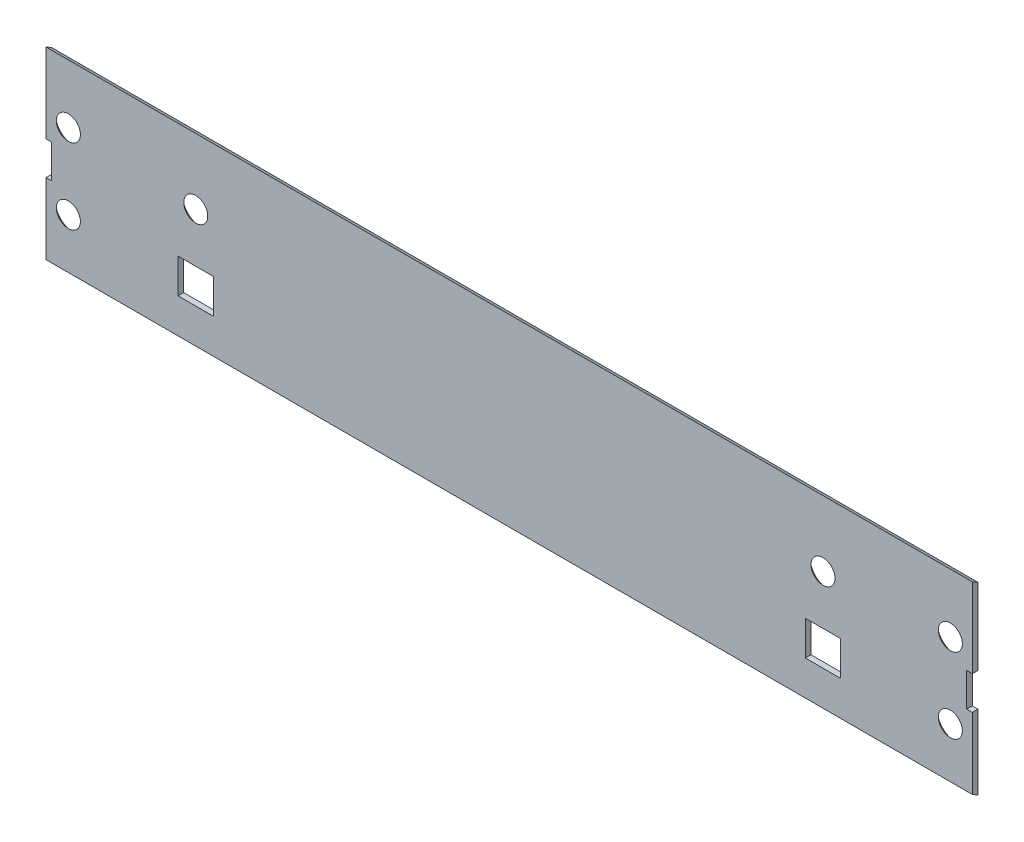
ISO-10303-21;
HEADER;
FILE_DESCRIPTION(('STEP AP214'),'2;1');
FILE_NAME('part.step','',(''),(''),'','','');
FILE_SCHEMA(('AUTOMOTIVE_DESIGN { 1 0 10303 214 1 1 1 1 }'));
ENDSEC;
DATA;
#1=APPLICATION_CONTEXT('core data for automotive mechanical design processes');
#2=APPLICATION_PROTOCOL_DEFINITION('international standard','automotive_design',2000,#1);
#3=PRODUCT_CONTEXT('',#1,'mechanical');
#4=PRODUCT('Part','Part','',(#3));
#5=PRODUCT_RELATED_PRODUCT_CATEGORY('part','',(#4));
#6=PRODUCT_DEFINITION_FORMATION('','',#4);
#7=PRODUCT_DEFINITION_CONTEXT('part definition',#1,'design');
#8=PRODUCT_DEFINITION('design','',#6,#7);
#9=PRODUCT_DEFINITION_SHAPE('','',#8);
#10=(LENGTH_UNIT() NAMED_UNIT(*) SI_UNIT(.MILLI.,.METRE.));
#11=(NAMED_UNIT(*) PLANE_ANGLE_UNIT() SI_UNIT($,.RADIAN.));
#12=(NAMED_UNIT(*) SI_UNIT($,.STERADIAN.) SOLID_ANGLE_UNIT());
#13=UNCERTAINTY_MEASURE_WITH_UNIT(LENGTH_MEASURE(1.E-05),#10,'distance_accuracy_value','');
#14=(GEOMETRIC_REPRESENTATION_CONTEXT(3) GLOBAL_UNCERTAINTY_ASSIGNED_CONTEXT((#13)) GLOBAL_UNIT_ASSIGNED_CONTEXT((#10,
#11,#12)) REPRESENTATION_CONTEXT('',''));
#15=CARTESIAN_POINT('',(0.,0.,0.));
#16=DIRECTION('',(0.,0.,1.));
#17=DIRECTION('',(1.,0.,0.));
#18=AXIS2_PLACEMENT_3D('',#15,#16,#17);
#19=CARTESIAN_POINT('',(0.,0.,1.0668));
#20=DIRECTION('',(0.,0.,1.));
#21=DIRECTION('',(1.,0.,0.));
#22=AXIS2_PLACEMENT_3D('',#19,#20,#21);
#23=PLANE('',#22);
#24=CARTESIAN_POINT('',(59.4550500000001,5.30763211581397,1.0668));
#25=DIRECTION('',(0.,0.,1.));
#26=DIRECTION('',(1.,0.,0.));
#27=AXIS2_PLACEMENT_3D('',#24,#25,#26);
#28=CIRCLE('',#27,2.2719372674205);
#29=CARTESIAN_POINT('',(61.7269872674206,5.30763211581397,1.0668));
#30=VERTEX_POINT('',#29);
#31=EDGE_CURVE('E442',#30,#30,#28,.T.);
#32=ORIENTED_EDGE('',*,*,#31,.F.);
#33=EDGE_LOOP('',(#32));
#34=FACE_BOUND('',#33,.T.);
#35=CARTESIAN_POINT('',(83.5850499999999,-7.64432822383008,1.0668));
#36=DIRECTION('',(0.,0.,1.));
#37=DIRECTION('',(1.,0.,0.));
#38=AXIS2_PLACEMENT_3D('',#35,#36,#37);
#39=CIRCLE('',#38,2.2719372674205);
#40=CARTESIAN_POINT('',(85.8569872674204,-7.64432822383008,1.0668));
#41=VERTEX_POINT('',#40);
#42=EDGE_CURVE('E439',#41,#41,#39,.T.);
#43=ORIENTED_EDGE('',*,*,#42,.F.);
#44=EDGE_LOOP('',(#43));
#45=FACE_BOUND('',#44,.T.);
#46=CARTESIAN_POINT('',(-59.3852,5.30763631581396,1.0668));
#47=DIRECTION('',(0.,0.,1.));
#48=DIRECTION('',(1.,0.,0.));
#49=AXIS2_PLACEMENT_3D('',#46,#47,#48);
#50=CIRCLE('',#49,2.2719372674205);
#51=CARTESIAN_POINT('',(-57.1132627325795,5.30763631581396,1.0668));
#52=VERTEX_POINT('',#51);
#53=EDGE_CURVE('E763',#52,#52,#50,.T.);
#54=ORIENTED_EDGE('',*,*,#53,.F.);
#55=EDGE_LOOP('',(#54));
#56=FACE_BOUND('',#55,.T.);
#57=CARTESIAN_POINT('',(-83.5152,-7.64432402382961,1.0668));
#58=DIRECTION('',(0.,0.,1.));
#59=DIRECTION('',(1.,0.,0.));
#60=AXIS2_PLACEMENT_3D('',#57,#58,#59);
#61=CIRCLE('',#60,2.2719372674205);
#62=CARTESIAN_POINT('',(-81.2432627325795,-7.64432402382961,1.0668));
#63=VERTEX_POINT('',#62);
#64=EDGE_CURVE('E188',#63,#63,#61,.T.);
#65=ORIENTED_EDGE('',*,*,#64,.F.);
#66=EDGE_LOOP('',(#65));
#67=FACE_BOUND('',#66,.T.);
#68=DIRECTION('',(0.,1.,0.));
#69=VECTOR('',#68,1.);
#70=CARTESIAN_POINT('',(56.1022500000001,0.,1.0668));
#71=LINE('',#70,#69);
#72=CARTESIAN_POINT('',(56.1022500000001,-10.567367884186,1.0668));
#73=VERTEX_POINT('',#72);
#74=CARTESIAN_POINT('',(56.1022500000001,-4.03956788418603,1.0668));
#75=VERTEX_POINT('',#74);
#76=EDGE_CURVE('E238',#73,#75,#71,.T.);
#77=ORIENTED_EDGE('',*,*,#76,.T.);
#78=DIRECTION('',(1.,0.,0.));
#79=VECTOR('',#78,1.);
#80=CARTESIAN_POINT('',(0.,-4.03956788418602,1.0668));
#81=LINE('',#80,#79);
#82=CARTESIAN_POINT('',(62.8078500000001,-4.03956788418604,1.0668));
#83=VERTEX_POINT('',#82);
#84=EDGE_CURVE('E243',#75,#83,#81,.T.);
#85=ORIENTED_EDGE('',*,*,#84,.T.);
#86=DIRECTION('',(0.,-1.,0.));
#87=VECTOR('',#86,1.);
#88=CARTESIAN_POINT('',(62.8078500000001,0.,1.0668));
#89=LINE('',#88,#87);
#90=CARTESIAN_POINT('',(62.8078500000001,-10.567367884186,1.0668));
#91=VERTEX_POINT('',#90);
#92=EDGE_CURVE('E252',#83,#91,#89,.T.);
#93=ORIENTED_EDGE('',*,*,#92,.T.);
#94=DIRECTION('',(-1.,0.,0.));
#95=VECTOR('',#94,1.);
#96=CARTESIAN_POINT('',(0.,-10.567367884186,1.0668));
#97=LINE('',#96,#95);
#98=EDGE_CURVE('E257',#91,#73,#97,.T.);
#99=ORIENTED_EDGE('',*,*,#98,.T.);
#100=EDGE_LOOP('',(#77,#85,#93,#99));
#101=FACE_BOUND('',#100,.T.);
#102=DIRECTION('',(0.,1.,0.));
#103=VECTOR('',#102,1.);
#104=CARTESIAN_POINT('',(-62.738,0.,1.0668));
#105=LINE('',#104,#103);
#106=CARTESIAN_POINT('',(-62.738,-10.567363684186,1.0668));
#107=VERTEX_POINT('',#106);
#108=CARTESIAN_POINT('',(-62.738,-4.03956368418605,1.0668));
#109=VERTEX_POINT('',#108);
#110=EDGE_CURVE('E245',#107,#109,#105,.T.);
#111=ORIENTED_EDGE('',*,*,#110,.T.);
#112=DIRECTION('',(1.,0.,0.));
#113=VECTOR('',#112,1.);
#114=CARTESIAN_POINT('',(0.,-4.03956368418606,1.0668));
#115=LINE('',#114,#113);
#116=CARTESIAN_POINT('',(-56.0324,-4.03956368418605,1.0668));
#117=VERTEX_POINT('',#116);
#118=EDGE_CURVE('E266',#109,#117,#115,.T.);
#119=ORIENTED_EDGE('',*,*,#118,.T.);
#120=DIRECTION('',(0.,-1.,0.));
#121=VECTOR('',#120,1.);
#122=CARTESIAN_POINT('',(-56.0324,0.,1.0668));
#123=LINE('',#122,#121);
#124=CARTESIAN_POINT('',(-56.0324,-10.567363684186,1.0668));
#125=VERTEX_POINT('',#124);
#126=EDGE_CURVE('E270',#117,#125,#123,.T.);
#127=ORIENTED_EDGE('',*,*,#126,.T.);
#128=DIRECTION('',(-1.,0.,0.));
#129=VECTOR('',#128,1.);
#130=CARTESIAN_POINT('',(0.,-10.5673636841861,1.0668));
#131=LINE('',#130,#129);
#132=EDGE_CURVE('E275',#125,#107,#131,.T.);
#133=ORIENTED_EDGE('',*,*,#132,.T.);
#134=EDGE_LOOP('',(#111,#119,#127,#133));
#135=FACE_BOUND('',#134,.T.);
#136=DIRECTION('',(-1.,0.,0.));
#137=VECTOR('',#136,1.);
#138=CARTESIAN_POINT('',(-86.7600499999999,-3.66971216592286,1.0668));
#139=LINE('',#138,#137);
#140=CARTESIAN_POINT('',(-86.7600499999999,-3.66971216592286,1.0668));
#141=VERTEX_POINT('',#140);
#142=CARTESIAN_POINT('',(-87.757,-3.66971216592286,1.0668));
#143=VERTEX_POINT('',#142);
#144=EDGE_CURVE('E183',#141,#143,#139,.T.);
#145=ORIENTED_EDGE('',*,*,#144,.T.);
#146=DIRECTION('',(0.,-1.,0.));
#147=VECTOR('',#146,1.);
#148=CARTESIAN_POINT('',(-87.757,17.7546,1.0668));
#149=LINE('',#148,#147);
#150=CARTESIAN_POINT('',(-87.757,-17.1386827328285,1.0668));
#151=VERTEX_POINT('',#150);
#152=EDGE_CURVE('E395',#143,#151,#149,.T.);
#153=ORIENTED_EDGE('',*,*,#152,.T.);
#154=DIRECTION('',(-1.,0.,0.));
#155=VECTOR('',#154,1.);
#156=CARTESIAN_POINT('',(87.757,-17.1386827328285,1.0668));
#157=LINE('',#156,#155);
#158=CARTESIAN_POINT('',(87.757,-17.1386827328285,1.0668));
#159=VERTEX_POINT('',#158);
#160=EDGE_CURVE('E372',#159,#151,#157,.T.);
#161=ORIENTED_EDGE('',*,*,#160,.F.);
#162=DIRECTION('',(0.,1.,0.));
#163=VECTOR('',#162,1.);
#164=CARTESIAN_POINT('',(87.757,17.7546,1.0668));
#165=LINE('',#164,#163);
#166=CARTESIAN_POINT('',(87.757,-3.66971636592319,1.0668));
#167=VERTEX_POINT('',#166);
#168=EDGE_CURVE('E382',#159,#167,#165,.T.);
#169=ORIENTED_EDGE('',*,*,#168,.T.);
#170=DIRECTION('',(-1.,0.,0.));
#171=VECTOR('',#170,1.);
#172=CARTESIAN_POINT('',(87.757,-3.66971636592319,1.0668));
#173=LINE('',#172,#171);
#174=CARTESIAN_POINT('',(86.6902,-3.66971636592319,1.0668));
#175=VERTEX_POINT('',#174);
#176=EDGE_CURVE('E313',#167,#175,#173,.T.);
#177=ORIENTED_EDGE('',*,*,#176,.T.);
#178=DIRECTION('',(0.,1.,0.));
#179=VECTOR('',#178,1.);
#180=CARTESIAN_POINT('',(86.6902,-3.66971636592319,1.0668));
#181=LINE('',#180,#179);
#182=CARTESIAN_POINT('',(86.6902,2.68028363407683,1.0668));
#183=VERTEX_POINT('',#182);
#184=EDGE_CURVE('E295',#175,#183,#181,.T.);
#185=ORIENTED_EDGE('',*,*,#184,.T.);
#186=DIRECTION('',(1.,-2.5367159941168E-13,0.));
#187=VECTOR('',#186,1.);
#188=CARTESIAN_POINT('',(86.6902,2.68028363407683,1.0668));
#189=LINE('',#188,#187);
#190=CARTESIAN_POINT('',(87.757,2.68028363407656,1.0668));
#191=VERTEX_POINT('',#190);
#192=EDGE_CURVE('E304',#183,#191,#189,.T.);
#193=ORIENTED_EDGE('',*,*,#192,.T.);
#194=CARTESIAN_POINT('',(87.757,17.7546,1.0668));
#195=VERTEX_POINT('',#194);
#196=EDGE_CURVE('E389',#191,#195,#165,.T.);
#197=ORIENTED_EDGE('',*,*,#196,.T.);
#198=DIRECTION('',(-1.,0.,0.));
#199=VECTOR('',#198,1.);
#200=CARTESIAN_POINT('',(-87.757,17.7546,1.0668));
#201=LINE('',#200,#199);
#202=CARTESIAN_POINT('',(-87.757,17.7546,1.0668));
#203=VERTEX_POINT('',#202);
#204=EDGE_CURVE('E388',#195,#203,#201,.T.);
#205=ORIENTED_EDGE('',*,*,#204,.T.);
#206=CARTESIAN_POINT('',(-87.757,2.68028783407717,1.0668));
#207=VERTEX_POINT('',#206);
#208=EDGE_CURVE('E48',#203,#207,#149,.T.);
#209=ORIENTED_EDGE('',*,*,#208,.T.);
#210=DIRECTION('',(1.,0.,0.));
#211=VECTOR('',#210,1.);
#212=CARTESIAN_POINT('',(-87.8268499999999,2.68028783407717,1.0668));
#213=LINE('',#212,#211);
#214=CARTESIAN_POINT('',(-86.7600499999999,2.68028783407717,1.0668));
#215=VERTEX_POINT('',#214);
#216=EDGE_CURVE('E208',#207,#215,#213,.T.);
#217=ORIENTED_EDGE('',*,*,#216,.T.);
#218=DIRECTION('',(0.,-1.,0.));
#219=VECTOR('',#218,1.);
#220=CARTESIAN_POINT('',(-86.7600499999999,2.68028783407717,1.0668));
#221=LINE('',#220,#219);
#222=EDGE_CURVE('E204',#215,#141,#221,.T.);
#223=ORIENTED_EDGE('',*,*,#222,.T.);
#224=EDGE_LOOP('',(#145,#153,#161,#169,#177,#185,#193,#197,#205,#209,#217,#223));
#225=FACE_BOUND('',#224,.T.);
#226=CARTESIAN_POINT('',(-83.5152,6.64317597617039,1.0668));
#227=DIRECTION('',(0.,0.,1.));
#228=DIRECTION('',(1.,0.,0.));
#229=AXIS2_PLACEMENT_3D('',#226,#227,#228);
#230=CIRCLE('',#229,2.2719372674205);
#231=CARTESIAN_POINT('',(-81.2432627325795,6.64317597617039,1.0668));
#232=VERTEX_POINT('',#231);
#233=EDGE_CURVE('E215',#232,#232,#230,.T.);
#234=ORIENTED_EDGE('',*,*,#233,.F.);
#235=EDGE_LOOP('',(#234));
#236=FACE_BOUND('',#235,.T.);
#237=CARTESIAN_POINT('',(83.5850499999999,6.64317177616992,1.0668));
#238=DIRECTION('',(0.,0.,1.));
#239=DIRECTION('',(1.,0.,0.));
#240=AXIS2_PLACEMENT_3D('',#237,#238,#239);
#241=CIRCLE('',#240,2.2719372674205);
#242=CARTESIAN_POINT('',(85.8569872674204,6.64317177616992,1.0668));
#243=VERTEX_POINT('',#242);
#244=EDGE_CURVE('E432',#243,#243,#241,.T.);
#245=ORIENTED_EDGE('',*,*,#244,.F.);
#246=EDGE_LOOP('',(#245));
#247=FACE_BOUND('',#246,.T.);
#248=ADVANCED_FACE('F40',(#34,#45,#56,#67,#101,#135,#225,#236,#247),#23,.T.);
#249=CARTESIAN_POINT('',(-87.757,17.7546,1.0668));
#250=DIRECTION('',(1.,0.,0.));
#251=DIRECTION('',(0.,0.,-1.));
#252=AXIS2_PLACEMENT_3D('',#249,#250,#251);
#253=PLANE('',#252);
#254=ORIENTED_EDGE('',*,*,#152,.F.);
#255=DIRECTION('',(0.,0.,-1.));
#256=VECTOR('',#255,1.);
#257=CARTESIAN_POINT('',(-87.757,-3.66971216592286,1.0668));
#258=LINE('',#257,#256);
#259=CARTESIAN_POINT('',(-87.757,-3.66971216592286,0.));
#260=VERTEX_POINT('',#259);
#261=EDGE_CURVE('E201',#143,#260,#258,.T.);
#262=ORIENTED_EDGE('',*,*,#261,.T.);
#263=DIRECTION('',(0.,-1.,0.));
#264=VECTOR('',#263,1.);
#265=CARTESIAN_POINT('',(-87.757,17.7546,0.));
#266=LINE('',#265,#264);
#267=CARTESIAN_POINT('',(-87.757,-17.7546,0.));
#268=VERTEX_POINT('',#267);
#269=EDGE_CURVE('E199',#260,#268,#266,.T.);
#270=ORIENTED_EDGE('',*,*,#269,.T.);
#271=DIRECTION('',(0.,-0.500000000000003,-0.866025403784437));
#272=VECTOR('',#271,1.);
#273=CARTESIAN_POINT('',(-87.757,-17.7546,0.));
#274=LINE('',#273,#272);
#275=EDGE_CURVE('E362',#151,#268,#274,.T.);
#276=ORIENTED_EDGE('',*,*,#275,.F.);
#277=EDGE_LOOP('',(#254,#262,#270,#276));
#278=FACE_BOUND('',#277,.T.);
#279=ADVANCED_FACE('F524',(#278),#253,.F.);
#280=CARTESIAN_POINT('',(87.757,17.7546,1.0668));
#281=DIRECTION('',(-1.,0.,0.));
#282=DIRECTION('',(0.,0.,1.));
#283=AXIS2_PLACEMENT_3D('',#280,#281,#282);
#284=PLANE('',#283);
#285=ORIENTED_EDGE('',*,*,#196,.F.);
#286=DIRECTION('',(0.,0.,-1.));
#287=VECTOR('',#286,1.);
#288=CARTESIAN_POINT('',(87.757,2.68028363407656,1.0668));
#289=LINE('',#288,#287);
#290=CARTESIAN_POINT('',(87.757,2.68028363407656,0.));
#291=VERTEX_POINT('',#290);
#292=EDGE_CURVE('E292',#191,#291,#289,.T.);
#293=ORIENTED_EDGE('',*,*,#292,.T.);
#294=DIRECTION('',(0.,1.,0.));
#295=VECTOR('',#294,1.);
#296=CARTESIAN_POINT('',(87.757,17.7546,0.));
#297=LINE('',#296,#295);
#298=CARTESIAN_POINT('',(87.757,17.1386827328285,0.));
#299=VERTEX_POINT('',#298);
#300=EDGE_CURVE('E404',#291,#299,#297,.T.);
#301=ORIENTED_EDGE('',*,*,#300,.T.);
#302=DIRECTION('',(0.,0.500000000000011,0.866025403784432));
#303=VECTOR('',#302,1.);
#304=CARTESIAN_POINT('',(87.757,17.1386827328285,0.));
#305=LINE('',#304,#303);
#306=EDGE_CURVE('E380',#299,#195,#305,.T.);
#307=ORIENTED_EDGE('',*,*,#306,.T.);
#308=EDGE_LOOP('',(#285,#293,#301,#307));
#309=FACE_BOUND('',#308,.T.);
#310=ADVANCED_FACE('F423',(#309),#284,.F.);
#311=CARTESIAN_POINT('',(87.757,-17.7546,0.));
#312=VERTEX_POINT('',#311);
#313=CARTESIAN_POINT('',(87.757,-3.66971636592318,0.));
#314=VERTEX_POINT('',#313);
#315=EDGE_CURVE('E400',#312,#314,#297,.T.);
#316=ORIENTED_EDGE('',*,*,#315,.T.);
#317=DIRECTION('',(0.,0.,-1.));
#318=VECTOR('',#317,1.);
#319=CARTESIAN_POINT('',(87.757,-3.66971636592319,1.0668));
#320=LINE('',#319,#318);
#321=EDGE_CURVE('E62',#167,#314,#320,.T.);
#322=ORIENTED_EDGE('',*,*,#321,.F.);
#323=ORIENTED_EDGE('',*,*,#168,.F.);
#324=DIRECTION('',(0.,-0.500000000000003,-0.866025403784437));
#325=VECTOR('',#324,1.);
#326=CARTESIAN_POINT('',(87.757,-17.7546,0.));
#327=LINE('',#326,#325);
#328=EDGE_CURVE('E369',#159,#312,#327,.T.);
#329=ORIENTED_EDGE('',*,*,#328,.T.);
#330=EDGE_LOOP('',(#316,#322,#323,#329));
#331=FACE_BOUND('',#330,.T.);
#332=ADVANCED_FACE('F42',(#331),#284,.F.);
#333=CARTESIAN_POINT('',(-87.757,17.1386827328285,0.));
#334=VERTEX_POINT('',#333);
#335=CARTESIAN_POINT('',(-87.757,2.68028783407717,0.));
#336=VERTEX_POINT('',#335);
#337=EDGE_CURVE('E405',#334,#336,#266,.T.);
#338=ORIENTED_EDGE('',*,*,#337,.T.);
#339=DIRECTION('',(0.,0.,1.));
#340=VECTOR('',#339,1.);
#341=CARTESIAN_POINT('',(-87.757,2.68028783407717,1.0668));
#342=LINE('',#341,#340);
#343=EDGE_CURVE('E55',#336,#207,#342,.T.);
#344=ORIENTED_EDGE('',*,*,#343,.T.);
#345=ORIENTED_EDGE('',*,*,#208,.F.);
#346=DIRECTION('',(0.,0.500000000000011,0.866025403784432));
#347=VECTOR('',#346,1.);
#348=CARTESIAN_POINT('',(-87.757,17.1386827328285,0.));
#349=LINE('',#348,#347);
#350=EDGE_CURVE('E379',#334,#203,#349,.T.);
#351=ORIENTED_EDGE('',*,*,#350,.F.);
#352=EDGE_LOOP('',(#338,#344,#345,#351));
#353=FACE_BOUND('',#352,.T.);
#354=ADVANCED_FACE('F427',(#353),#253,.F.);
#355=CARTESIAN_POINT('',(0.,0.,0.));
#356=DIRECTION('',(0.,0.,1.));
#357=DIRECTION('',(1.,0.,0.));
#358=AXIS2_PLACEMENT_3D('',#355,#356,#357);
#359=PLANE('',#358);
#360=CARTESIAN_POINT('',(59.4550500000001,5.30763211581397,0.));
#361=DIRECTION('',(0.,0.,-1.));
#362=DIRECTION('',(-1.,0.,0.));
#363=AXIS2_PLACEMENT_3D('',#360,#361,#362);
#364=CIRCLE('',#363,3.5433);
#365=CARTESIAN_POINT('',(55.9117500000001,5.30763211581397,0.));
#366=VERTEX_POINT('',#365);
#367=EDGE_CURVE('E457',#366,#366,#364,.T.);
#368=ORIENTED_EDGE('',*,*,#367,.F.);
#369=EDGE_LOOP('',(#368));
#370=FACE_BOUND('',#369,.T.);
#371=CARTESIAN_POINT('',(83.5850499999999,6.64317177616992,0.));
#372=DIRECTION('',(0.,0.,-1.));
#373=DIRECTION('',(-1.,0.,0.));
#374=AXIS2_PLACEMENT_3D('',#371,#372,#373);
#375=CIRCLE('',#374,3.5433);
#376=CARTESIAN_POINT('',(80.0417499999999,6.64317177616992,0.));
#377=VERTEX_POINT('',#376);
#378=EDGE_CURVE('E435',#377,#377,#375,.T.);
#379=ORIENTED_EDGE('',*,*,#378,.F.);
#380=EDGE_LOOP('',(#379));
#381=FACE_BOUND('',#380,.T.);
#382=CARTESIAN_POINT('',(83.5850499999999,-7.64432822383008,0.));
#383=DIRECTION('',(0.,0.,-1.));
#384=DIRECTION('',(-1.,0.,0.));
#385=AXIS2_PLACEMENT_3D('',#382,#383,#384);
#386=CIRCLE('',#385,3.5433);
#387=CARTESIAN_POINT('',(80.0417499999999,-7.64432822383008,0.));
#388=VERTEX_POINT('',#387);
#389=EDGE_CURVE('E434',#388,#388,#386,.T.);
#390=ORIENTED_EDGE('',*,*,#389,.F.);
#391=EDGE_LOOP('',(#390));
#392=FACE_BOUND('',#391,.T.);
#393=CARTESIAN_POINT('',(-59.3852,5.30763631581396,0.));
#394=DIRECTION('',(0.,0.,-1.));
#395=DIRECTION('',(-1.,0.,0.));
#396=AXIS2_PLACEMENT_3D('',#393,#394,#395);
#397=CIRCLE('',#396,3.5433);
#398=CARTESIAN_POINT('',(-62.9285,5.30763631581396,0.));
#399=VERTEX_POINT('',#398);
#400=EDGE_CURVE('E451',#399,#399,#397,.T.);
#401=ORIENTED_EDGE('',*,*,#400,.F.);
#402=EDGE_LOOP('',(#401));
#403=FACE_BOUND('',#402,.T.);
#404=CARTESIAN_POINT('',(-83.5152,6.64317597617039,0.));
#405=DIRECTION('',(0.,0.,-1.));
#406=DIRECTION('',(-1.,0.,0.));
#407=AXIS2_PLACEMENT_3D('',#404,#405,#406);
#408=CIRCLE('',#407,3.5433);
#409=CARTESIAN_POINT('',(-87.0585,6.64317597617039,0.));
#410=VERTEX_POINT('',#409);
#411=EDGE_CURVE('E222',#410,#410,#408,.T.);
#412=ORIENTED_EDGE('',*,*,#411,.F.);
#413=EDGE_LOOP('',(#412));
#414=FACE_BOUND('',#413,.T.);
#415=CARTESIAN_POINT('',(-83.5152,-7.64432402382961,0.));
#416=DIRECTION('',(0.,0.,-1.));
#417=DIRECTION('',(-1.,0.,0.));
#418=AXIS2_PLACEMENT_3D('',#415,#416,#417);
#419=CIRCLE('',#418,3.5433);
#420=CARTESIAN_POINT('',(-87.0585,-7.64432402382961,0.));
#421=VERTEX_POINT('',#420);
#422=EDGE_CURVE('E221',#421,#421,#419,.T.);
#423=ORIENTED_EDGE('',*,*,#422,.F.);
#424=EDGE_LOOP('',(#423));
#425=FACE_BOUND('',#424,.T.);
#426=DIRECTION('',(1.,0.,0.));
#427=VECTOR('',#426,1.);
#428=CARTESIAN_POINT('',(0.,-4.03956368418606,0.));
#429=LINE('',#428,#427);
#430=CARTESIAN_POINT('',(-62.738,-4.03956368418605,0.));
#431=VERTEX_POINT('',#430);
#432=CARTESIAN_POINT('',(-56.0324,-4.03956368418605,0.));
#433=VERTEX_POINT('',#432);
#434=EDGE_CURVE('E339',#431,#433,#429,.T.);
#435=ORIENTED_EDGE('',*,*,#434,.F.);
#436=DIRECTION('',(0.,1.,0.));
#437=VECTOR('',#436,1.);
#438=CARTESIAN_POINT('',(-62.738,0.,0.));
#439=LINE('',#438,#437);
#440=CARTESIAN_POINT('',(-62.738,-10.567363684186,0.));
#441=VERTEX_POINT('',#440);
#442=EDGE_CURVE('E281',#441,#431,#439,.T.);
#443=ORIENTED_EDGE('',*,*,#442,.F.);
#444=DIRECTION('',(-1.,0.,0.));
#445=VECTOR('',#444,1.);
#446=CARTESIAN_POINT('',(0.,-10.5673636841861,0.));
#447=LINE('',#446,#445);
#448=CARTESIAN_POINT('',(-56.0324,-10.567363684186,0.));
#449=VERTEX_POINT('',#448);
#450=EDGE_CURVE('E334',#449,#441,#447,.T.);
#451=ORIENTED_EDGE('',*,*,#450,.F.);
#452=DIRECTION('',(0.,-1.,0.));
#453=VECTOR('',#452,1.);
#454=CARTESIAN_POINT('',(-56.0324,0.,0.));
#455=LINE('',#454,#453);
#456=EDGE_CURVE('E337',#433,#449,#455,.T.);
#457=ORIENTED_EDGE('',*,*,#456,.F.);
#458=EDGE_LOOP('',(#435,#443,#451,#457));
#459=FACE_BOUND('',#458,.T.);
#460=DIRECTION('',(1.,0.,0.));
#461=VECTOR('',#460,1.);
#462=CARTESIAN_POINT('',(0.,-4.03956788418602,0.));
#463=LINE('',#462,#461);
#464=CARTESIAN_POINT('',(56.1022500000001,-4.03956788418603,0.));
#465=VERTEX_POINT('',#464);
#466=CARTESIAN_POINT('',(62.8078500000001,-4.03956788418604,0.));
#467=VERTEX_POINT('',#466);
#468=EDGE_CURVE('E348',#465,#467,#463,.T.);
#469=ORIENTED_EDGE('',*,*,#468,.F.);
#470=DIRECTION('',(0.,1.,0.));
#471=VECTOR('',#470,1.);
#472=CARTESIAN_POINT('',(56.1022500000001,0.,0.));
#473=LINE('',#472,#471);
#474=CARTESIAN_POINT('',(56.1022500000001,-10.567367884186,0.));
#475=VERTEX_POINT('',#474);
#476=EDGE_CURVE('E345',#475,#465,#473,.T.);
#477=ORIENTED_EDGE('',*,*,#476,.F.);
#478=DIRECTION('',(-1.,0.,0.));
#479=VECTOR('',#478,1.);
#480=CARTESIAN_POINT('',(0.,-10.567367884186,0.));
#481=LINE('',#480,#479);
#482=CARTESIAN_POINT('',(62.8078500000001,-10.567367884186,0.));
#483=VERTEX_POINT('',#482);
#484=EDGE_CURVE('E244',#483,#475,#481,.T.);
#485=ORIENTED_EDGE('',*,*,#484,.F.);
#486=DIRECTION('',(0.,-1.,0.));
#487=VECTOR('',#486,1.);
#488=CARTESIAN_POINT('',(62.8078500000001,0.,0.));
#489=LINE('',#488,#487);
#490=EDGE_CURVE('E353',#467,#483,#489,.T.);
#491=ORIENTED_EDGE('',*,*,#490,.F.);
#492=EDGE_LOOP('',(#469,#477,#485,#491));
#493=FACE_BOUND('',#492,.T.);
#494=ORIENTED_EDGE('',*,*,#269,.F.);
#495=DIRECTION('',(-1.,0.,0.));
#496=VECTOR('',#495,1.);
#497=CARTESIAN_POINT('',(-86.7600499999999,-3.66971216592286,0.));
#498=LINE('',#497,#496);
#499=CARTESIAN_POINT('',(-86.7600499999999,-3.66971216592286,0.));
#500=VERTEX_POINT('',#499);
#501=EDGE_CURVE('E180',#500,#260,#498,.T.);
#502=ORIENTED_EDGE('',*,*,#501,.F.);
#503=DIRECTION('',(0.,-1.,0.));
#504=VECTOR('',#503,1.);
#505=CARTESIAN_POINT('',(-86.7600499999999,2.68028783407717,0.));
#506=LINE('',#505,#504);
#507=CARTESIAN_POINT('',(-86.7600499999999,2.68028783407717,0.));
#508=VERTEX_POINT('',#507);
#509=EDGE_CURVE('E192',#508,#500,#506,.T.);
#510=ORIENTED_EDGE('',*,*,#509,.F.);
#511=DIRECTION('',(-1.,0.,0.));
#512=VECTOR('',#511,1.);
#513=CARTESIAN_POINT('',(0.,2.68028783407717,0.));
#514=LINE('',#513,#512);
#515=EDGE_CURVE('E12',#508,#336,#514,.T.);
#516=ORIENTED_EDGE('',*,*,#515,.T.);
#517=ORIENTED_EDGE('',*,*,#337,.F.);
#518=DIRECTION('',(-1.,0.,0.));
#519=VECTOR('',#518,1.);
#520=CARTESIAN_POINT('',(87.757,17.1386827328285,0.));
#521=LINE('',#520,#519);
#522=EDGE_CURVE('E390',#299,#334,#521,.T.);
#523=ORIENTED_EDGE('',*,*,#522,.F.);
#524=ORIENTED_EDGE('',*,*,#300,.F.);
#525=DIRECTION('',(1.,-2.5367159941168E-13,0.));
#526=VECTOR('',#525,1.);
#527=CARTESIAN_POINT('',(86.6902,2.68028363407683,0.));
#528=LINE('',#527,#526);
#529=CARTESIAN_POINT('',(86.6902,2.68028363407683,0.));
#530=VERTEX_POINT('',#529);
#531=EDGE_CURVE('E306',#530,#291,#528,.T.);
#532=ORIENTED_EDGE('',*,*,#531,.F.);
#533=DIRECTION('',(0.,1.,0.));
#534=VECTOR('',#533,1.);
#535=CARTESIAN_POINT('',(86.6902,-3.66971636592319,0.));
#536=LINE('',#535,#534);
#537=CARTESIAN_POINT('',(86.6902,-3.66971636592319,0.));
#538=VERTEX_POINT('',#537);
#539=EDGE_CURVE('E300',#538,#530,#536,.T.);
#540=ORIENTED_EDGE('',*,*,#539,.F.);
#541=DIRECTION('',(-1.,0.,0.));
#542=VECTOR('',#541,1.);
#543=CARTESIAN_POINT('',(87.757,-3.66971636592319,0.));
#544=LINE('',#543,#542);
#545=EDGE_CURVE('E303',#314,#538,#544,.T.);
#546=ORIENTED_EDGE('',*,*,#545,.F.);
#547=ORIENTED_EDGE('',*,*,#315,.F.);
#548=DIRECTION('',(1.,0.,0.));
#549=VECTOR('',#548,1.);
#550=CARTESIAN_POINT('',(-87.757,-17.7546,0.));
#551=LINE('',#550,#549);
#552=EDGE_CURVE('E407',#268,#312,#551,.T.);
#553=ORIENTED_EDGE('',*,*,#552,.F.);
#554=EDGE_LOOP('',(#494,#502,#510,#516,#517,#523,#524,#532,#540,#546,#547,#553));
#555=FACE_BOUND('',#554,.T.);
#556=ADVANCED_FACE('F197',(#370,#381,#392,#403,#414,#425,#459,#493,#555),#359,.F.);
#557=CARTESIAN_POINT('',(87.757,17.1386827328285,0.));
#558=DIRECTION('',(0.,-0.866025403784432,0.500000000000011));
#559=DIRECTION('',(0.,-0.500000000000011,-0.866025403784432));
#560=AXIS2_PLACEMENT_3D('',#557,#558,#559);
#561=PLANE('',#560);
#562=ORIENTED_EDGE('',*,*,#350,.T.);
#563=ORIENTED_EDGE('',*,*,#204,.F.);
#564=ORIENTED_EDGE('',*,*,#306,.F.);
#565=ORIENTED_EDGE('',*,*,#522,.T.);
#566=EDGE_LOOP('',(#562,#563,#564,#565));
#567=FACE_BOUND('',#566,.T.);
#568=ADVANCED_FACE('F420',(#567),#561,.F.);
#569=CARTESIAN_POINT('',(87.757,-17.7546,0.));
#570=DIRECTION('',(0.,0.866025403784437,-0.500000000000003));
#571=DIRECTION('',(0.,0.500000000000003,0.866025403784437));
#572=AXIS2_PLACEMENT_3D('',#569,#570,#571);
#573=PLANE('',#572);
#574=ORIENTED_EDGE('',*,*,#275,.T.);
#575=ORIENTED_EDGE('',*,*,#552,.T.);
#576=ORIENTED_EDGE('',*,*,#328,.F.);
#577=ORIENTED_EDGE('',*,*,#160,.T.);
#578=EDGE_LOOP('',(#574,#575,#576,#577));
#579=FACE_BOUND('',#578,.T.);
#580=ADVANCED_FACE('F554',(#579),#573,.F.);
#581=CARTESIAN_POINT('',(56.1022500000001,0.,1.0668));
#582=DIRECTION('',(-1.,0.,0.));
#583=DIRECTION('',(0.,0.,1.));
#584=AXIS2_PLACEMENT_3D('',#581,#582,#583);
#585=PLANE('',#584);
#586=ORIENTED_EDGE('',*,*,#476,.T.);
#587=DIRECTION('',(0.,0.,-1.));
#588=VECTOR('',#587,1.);
#589=CARTESIAN_POINT('',(56.1022500000001,-4.03956788418603,1.0668));
#590=LINE('',#589,#588);
#591=EDGE_CURVE('E367',#75,#465,#590,.T.);
#592=ORIENTED_EDGE('',*,*,#591,.F.);
#593=ORIENTED_EDGE('',*,*,#76,.F.);
#594=DIRECTION('',(0.,0.,-1.));
#595=VECTOR('',#594,1.);
#596=CARTESIAN_POINT('',(56.1022500000001,-10.567367884186,1.0668));
#597=LINE('',#596,#595);
#598=EDGE_CURVE('E360',#73,#475,#597,.T.);
#599=ORIENTED_EDGE('',*,*,#598,.T.);
#600=EDGE_LOOP('',(#586,#592,#593,#599));
#601=FACE_BOUND('',#600,.T.);
#602=ADVANCED_FACE('F487',(#601),#585,.F.);
#603=CARTESIAN_POINT('',(0.,-10.567367884186,1.0668));
#604=DIRECTION('',(0.,-1.,0.));
#605=DIRECTION('',(1.,0.,0.));
#606=AXIS2_PLACEMENT_3D('',#603,#604,#605);
#607=PLANE('',#606);
#608=ORIENTED_EDGE('',*,*,#484,.T.);
#609=ORIENTED_EDGE('',*,*,#598,.F.);
#610=ORIENTED_EDGE('',*,*,#98,.F.);
#611=DIRECTION('',(0.,0.,-1.));
#612=VECTOR('',#611,1.);
#613=CARTESIAN_POINT('',(62.8078500000001,-10.567367884186,1.0668));
#614=LINE('',#613,#612);
#615=EDGE_CURVE('E363',#91,#483,#614,.T.);
#616=ORIENTED_EDGE('',*,*,#615,.T.);
#617=EDGE_LOOP('',(#608,#609,#610,#616));
#618=FACE_BOUND('',#617,.T.);
#619=ADVANCED_FACE('F716',(#618),#607,.F.);
#620=CARTESIAN_POINT('',(62.8078500000001,0.,1.0668));
#621=DIRECTION('',(1.,0.,0.));
#622=DIRECTION('',(0.,0.,-1.));
#623=AXIS2_PLACEMENT_3D('',#620,#621,#622);
#624=PLANE('',#623);
#625=ORIENTED_EDGE('',*,*,#490,.T.);
#626=ORIENTED_EDGE('',*,*,#615,.F.);
#627=ORIENTED_EDGE('',*,*,#92,.F.);
#628=DIRECTION('',(0.,0.,-1.));
#629=VECTOR('',#628,1.);
#630=CARTESIAN_POINT('',(62.8078500000001,-4.03956788418604,1.0668));
#631=LINE('',#630,#629);
#632=EDGE_CURVE('E365',#83,#467,#631,.T.);
#633=ORIENTED_EDGE('',*,*,#632,.T.);
#634=EDGE_LOOP('',(#625,#626,#627,#633));
#635=FACE_BOUND('',#634,.T.);
#636=ADVANCED_FACE('F707',(#635),#624,.F.);
#637=CARTESIAN_POINT('',(0.,-4.03956788418602,1.0668));
#638=DIRECTION('',(0.,1.,0.));
#639=DIRECTION('',(-1.,0.,0.));
#640=AXIS2_PLACEMENT_3D('',#637,#638,#639);
#641=PLANE('',#640);
#642=ORIENTED_EDGE('',*,*,#468,.T.);
#643=ORIENTED_EDGE('',*,*,#632,.F.);
#644=ORIENTED_EDGE('',*,*,#84,.F.);
#645=ORIENTED_EDGE('',*,*,#591,.T.);
#646=EDGE_LOOP('',(#642,#643,#644,#645));
#647=FACE_BOUND('',#646,.T.);
#648=ADVANCED_FACE('F484',(#647),#641,.F.);
#649=CARTESIAN_POINT('',(-62.738,0.,1.0668));
#650=DIRECTION('',(-1.,0.,0.));
#651=DIRECTION('',(0.,0.,1.));
#652=AXIS2_PLACEMENT_3D('',#649,#650,#651);
#653=PLANE('',#652);
#654=ORIENTED_EDGE('',*,*,#442,.T.);
#655=DIRECTION('',(0.,0.,-1.));
#656=VECTOR('',#655,1.);
#657=CARTESIAN_POINT('',(-62.738,-4.03956368418605,1.0668));
#658=LINE('',#657,#656);
#659=EDGE_CURVE('E280',#109,#431,#658,.T.);
#660=ORIENTED_EDGE('',*,*,#659,.F.);
#661=ORIENTED_EDGE('',*,*,#110,.F.);
#662=DIRECTION('',(0.,0.,-1.));
#663=VECTOR('',#662,1.);
#664=CARTESIAN_POINT('',(-62.738,-10.567363684186,1.0668));
#665=LINE('',#664,#663);
#666=EDGE_CURVE('E308',#107,#441,#665,.T.);
#667=ORIENTED_EDGE('',*,*,#666,.T.);
#668=EDGE_LOOP('',(#654,#660,#661,#667));
#669=FACE_BOUND('',#668,.T.);
#670=ADVANCED_FACE('F689',(#669),#653,.F.);
#671=CARTESIAN_POINT('',(0.,-10.5673636841861,1.0668));
#672=DIRECTION('',(0.,-1.,0.));
#673=DIRECTION('',(1.,0.,0.));
#674=AXIS2_PLACEMENT_3D('',#671,#672,#673);
#675=PLANE('',#674);
#676=ORIENTED_EDGE('',*,*,#450,.T.);
#677=ORIENTED_EDGE('',*,*,#666,.F.);
#678=ORIENTED_EDGE('',*,*,#132,.F.);
#679=DIRECTION('',(0.,0.,-1.));
#680=VECTOR('',#679,1.);
#681=CARTESIAN_POINT('',(-56.0324,-10.567363684186,1.0668));
#682=LINE('',#681,#680);
#683=EDGE_CURVE('E331',#125,#449,#682,.T.);
#684=ORIENTED_EDGE('',*,*,#683,.T.);
#685=EDGE_LOOP('',(#676,#677,#678,#684));
#686=FACE_BOUND('',#685,.T.);
#687=ADVANCED_FACE('F679',(#686),#675,.F.);
#688=CARTESIAN_POINT('',(-56.0324,0.,1.0668));
#689=DIRECTION('',(1.,0.,0.));
#690=DIRECTION('',(0.,0.,-1.));
#691=AXIS2_PLACEMENT_3D('',#688,#689,#690);
#692=PLANE('',#691);
#693=ORIENTED_EDGE('',*,*,#456,.T.);
#694=ORIENTED_EDGE('',*,*,#683,.F.);
#695=ORIENTED_EDGE('',*,*,#126,.F.);
#696=DIRECTION('',(0.,0.,-1.));
#697=VECTOR('',#696,1.);
#698=CARTESIAN_POINT('',(-56.0324,-4.03956368418605,1.0668));
#699=LINE('',#698,#697);
#700=EDGE_CURVE('E329',#117,#433,#699,.T.);
#701=ORIENTED_EDGE('',*,*,#700,.T.);
#702=EDGE_LOOP('',(#693,#694,#695,#701));
#703=FACE_BOUND('',#702,.T.);
#704=ADVANCED_FACE('F519',(#703),#692,.F.);
#705=CARTESIAN_POINT('',(0.,-4.03956368418606,1.0668));
#706=DIRECTION('',(0.,1.,0.));
#707=DIRECTION('',(-1.,0.,0.));
#708=AXIS2_PLACEMENT_3D('',#705,#706,#707);
#709=PLANE('',#708);
#710=ORIENTED_EDGE('',*,*,#434,.T.);
#711=ORIENTED_EDGE('',*,*,#700,.F.);
#712=ORIENTED_EDGE('',*,*,#118,.F.);
#713=ORIENTED_EDGE('',*,*,#659,.T.);
#714=EDGE_LOOP('',(#710,#711,#712,#713));
#715=FACE_BOUND('',#714,.T.);
#716=ADVANCED_FACE('F512',(#715),#709,.F.);
#717=CARTESIAN_POINT('',(86.6902,2.68028363407683,1.0668));
#718=DIRECTION('',(2.5367159941168E-13,1.,0.));
#719=DIRECTION('',(-1.,2.5367159941168E-13,0.));
#720=AXIS2_PLACEMENT_3D('',#717,#718,#719);
#721=PLANE('',#720);
#722=ORIENTED_EDGE('',*,*,#531,.T.);
#723=ORIENTED_EDGE('',*,*,#292,.F.);
#724=ORIENTED_EDGE('',*,*,#192,.F.);
#725=DIRECTION('',(0.,0.,-1.));
#726=VECTOR('',#725,1.);
#727=CARTESIAN_POINT('',(86.6902,2.68028363407683,1.0668));
#728=LINE('',#727,#726);
#729=EDGE_CURVE('E291',#183,#530,#728,.T.);
#730=ORIENTED_EDGE('',*,*,#729,.T.);
#731=EDGE_LOOP('',(#722,#723,#724,#730));
#732=FACE_BOUND('',#731,.T.);
#733=ADVANCED_FACE('F510',(#732),#721,.F.);
#734=CARTESIAN_POINT('',(86.6902,-3.66971636592319,1.0668));
#735=DIRECTION('',(-1.,0.,0.));
#736=DIRECTION('',(0.,0.,1.));
#737=AXIS2_PLACEMENT_3D('',#734,#735,#736);
#738=PLANE('',#737);
#739=ORIENTED_EDGE('',*,*,#539,.T.);
#740=ORIENTED_EDGE('',*,*,#729,.F.);
#741=ORIENTED_EDGE('',*,*,#184,.F.);
#742=DIRECTION('',(0.,0.,-1.));
#743=VECTOR('',#742,1.);
#744=CARTESIAN_POINT('',(86.6902,-3.66971636592319,1.0668));
#745=LINE('',#744,#743);
#746=EDGE_CURVE('E297',#175,#538,#745,.T.);
#747=ORIENTED_EDGE('',*,*,#746,.T.);
#748=EDGE_LOOP('',(#739,#740,#741,#747));
#749=FACE_BOUND('',#748,.T.);
#750=ADVANCED_FACE('F508',(#749),#738,.F.);
#751=CARTESIAN_POINT('',(87.757,-3.66971636592319,1.0668));
#752=DIRECTION('',(0.,-1.,0.));
#753=DIRECTION('',(0.,0.,-1.));
#754=AXIS2_PLACEMENT_3D('',#751,#752,#753);
#755=PLANE('',#754);
#756=ORIENTED_EDGE('',*,*,#545,.T.);
#757=ORIENTED_EDGE('',*,*,#746,.F.);
#758=ORIENTED_EDGE('',*,*,#176,.F.);
#759=ORIENTED_EDGE('',*,*,#321,.T.);
#760=EDGE_LOOP('',(#756,#757,#758,#759));
#761=FACE_BOUND('',#760,.T.);
#762=ADVANCED_FACE('F502',(#761),#755,.F.);
#763=CARTESIAN_POINT('',(-86.7600499999999,-3.66971216592286,1.0668));
#764=DIRECTION('',(0.,-1.,0.));
#765=DIRECTION('',(0.,0.,-1.));
#766=AXIS2_PLACEMENT_3D('',#763,#764,#765);
#767=PLANE('',#766);
#768=ORIENTED_EDGE('',*,*,#144,.F.);
#769=DIRECTION('',(0.,0.,-1.));
#770=VECTOR('',#769,1.);
#771=CARTESIAN_POINT('',(-86.7600499999999,-3.66971216592286,1.0668));
#772=LINE('',#771,#770);
#773=EDGE_CURVE('E176',#141,#500,#772,.T.);
#774=ORIENTED_EDGE('',*,*,#773,.T.);
#775=ORIENTED_EDGE('',*,*,#501,.T.);
#776=ORIENTED_EDGE('',*,*,#261,.F.);
#777=EDGE_LOOP('',(#768,#774,#775,#776));
#778=FACE_BOUND('',#777,.T.);
#779=ADVANCED_FACE('F178',(#778),#767,.F.);
#780=CARTESIAN_POINT('',(-87.8268499999999,2.68028783407717,1.0668));
#781=DIRECTION('',(0.,1.,0.));
#782=DIRECTION('',(0.,0.,1.));
#783=AXIS2_PLACEMENT_3D('',#780,#781,#782);
#784=PLANE('',#783);
#785=ORIENTED_EDGE('',*,*,#515,.F.);
#786=DIRECTION('',(0.,0.,-1.));
#787=VECTOR('',#786,1.);
#788=CARTESIAN_POINT('',(-86.7600499999999,2.68028783407717,1.0668));
#789=LINE('',#788,#787);
#790=EDGE_CURVE('E187',#215,#508,#789,.T.);
#791=ORIENTED_EDGE('',*,*,#790,.F.);
#792=ORIENTED_EDGE('',*,*,#216,.F.);
#793=ORIENTED_EDGE('',*,*,#343,.F.);
#794=EDGE_LOOP('',(#785,#791,#792,#793));
#795=FACE_BOUND('',#794,.T.);
#796=ADVANCED_FACE('F428',(#795),#784,.F.);
#797=CARTESIAN_POINT('',(-86.7600499999999,2.68028783407717,1.0668));
#798=DIRECTION('',(1.,0.,0.));
#799=DIRECTION('',(0.,0.,-1.));
#800=AXIS2_PLACEMENT_3D('',#797,#798,#799);
#801=PLANE('',#800);
#802=ORIENTED_EDGE('',*,*,#509,.T.);
#803=ORIENTED_EDGE('',*,*,#773,.F.);
#804=ORIENTED_EDGE('',*,*,#222,.F.);
#805=ORIENTED_EDGE('',*,*,#790,.T.);
#806=EDGE_LOOP('',(#802,#803,#804,#805));
#807=FACE_BOUND('',#806,.T.);
#808=ADVANCED_FACE('F193',(#807),#801,.F.);
#809=CARTESIAN_POINT('',(-83.5152,-7.64432402382961,0.));
#810=DIRECTION('',(0.,0.,-1.));
#811=DIRECTION('',(-1.,0.,0.));
#812=AXIS2_PLACEMENT_3D('',#809,#810,#811);
#813=CONICAL_SURFACE('',#812,3.5433,0.872664625997163);
#814=ORIENTED_EDGE('',*,*,#64,.T.);
#815=EDGE_LOOP('',(#814));
#816=FACE_BOUND('',#815,.T.);
#817=ORIENTED_EDGE('',*,*,#422,.T.);
#818=EDGE_LOOP('',(#817));
#819=FACE_BOUND('',#818,.T.);
#820=ADVANCED_FACE('F580',(#816,#819),#813,.F.);
#821=CARTESIAN_POINT('',(-83.5152,6.64317597617039,0.));
#822=DIRECTION('',(0.,0.,-1.));
#823=DIRECTION('',(-1.,0.,0.));
#824=AXIS2_PLACEMENT_3D('',#821,#822,#823);
#825=CONICAL_SURFACE('',#824,3.5433,0.872664625997163);
#826=ORIENTED_EDGE('',*,*,#233,.T.);
#827=EDGE_LOOP('',(#826));
#828=FACE_BOUND('',#827,.T.);
#829=ORIENTED_EDGE('',*,*,#411,.T.);
#830=EDGE_LOOP('',(#829));
#831=FACE_BOUND('',#830,.T.);
#832=ADVANCED_FACE('F585',(#828,#831),#825,.F.);
#833=CARTESIAN_POINT('',(-59.3852,5.30763631581396,0.));
#834=DIRECTION('',(0.,0.,-1.));
#835=DIRECTION('',(-1.,0.,0.));
#836=AXIS2_PLACEMENT_3D('',#833,#834,#835);
#837=CONICAL_SURFACE('',#836,3.5433,0.872664625997163);
#838=ORIENTED_EDGE('',*,*,#53,.T.);
#839=EDGE_LOOP('',(#838));
#840=FACE_BOUND('',#839,.T.);
#841=ORIENTED_EDGE('',*,*,#400,.T.);
#842=EDGE_LOOP('',(#841));
#843=FACE_BOUND('',#842,.T.);
#844=ADVANCED_FACE('F596',(#840,#843),#837,.F.);
#845=CARTESIAN_POINT('',(83.5850499999999,-7.64432822383008,0.));
#846=DIRECTION('',(0.,0.,-1.));
#847=DIRECTION('',(-1.,0.,0.));
#848=AXIS2_PLACEMENT_3D('',#845,#846,#847);
#849=CONICAL_SURFACE('',#848,3.5433,0.872664625997163);
#850=ORIENTED_EDGE('',*,*,#42,.T.);
#851=EDGE_LOOP('',(#850));
#852=FACE_BOUND('',#851,.T.);
#853=ORIENTED_EDGE('',*,*,#389,.T.);
#854=EDGE_LOOP('',(#853));
#855=FACE_BOUND('',#854,.T.);
#856=ADVANCED_FACE('F606',(#852,#855),#849,.F.);
#857=CARTESIAN_POINT('',(83.5850499999999,6.64317177616992,0.));
#858=DIRECTION('',(0.,0.,-1.));
#859=DIRECTION('',(-1.,0.,0.));
#860=AXIS2_PLACEMENT_3D('',#857,#858,#859);
#861=CONICAL_SURFACE('',#860,3.5433,0.872664625997163);
#862=ORIENTED_EDGE('',*,*,#244,.T.);
#863=EDGE_LOOP('',(#862));
#864=FACE_BOUND('',#863,.T.);
#865=ORIENTED_EDGE('',*,*,#378,.T.);
#866=EDGE_LOOP('',(#865));
#867=FACE_BOUND('',#866,.T.);
#868=ADVANCED_FACE('F616',(#864,#867),#861,.F.);
#869=CARTESIAN_POINT('',(59.4550500000001,5.30763211581397,0.));
#870=DIRECTION('',(0.,0.,-1.));
#871=DIRECTION('',(-1.,0.,0.));
#872=AXIS2_PLACEMENT_3D('',#869,#870,#871);
#873=CONICAL_SURFACE('',#872,3.5433,0.872664625997163);
#874=ORIENTED_EDGE('',*,*,#31,.T.);
#875=EDGE_LOOP('',(#874));
#876=FACE_BOUND('',#875,.T.);
#877=ORIENTED_EDGE('',*,*,#367,.T.);
#878=EDGE_LOOP('',(#877));
#879=FACE_BOUND('',#878,.T.);
#880=ADVANCED_FACE('F461',(#876,#879),#873,.F.);
#881=CLOSED_SHELL('',(#248,#279,#310,#332,#354,#556,#568,#580,#602,#619,#636,#648,#670,#687,
#704,#716,#733,#750,#762,#779,#796,#808,#820,#832,#844,#856,#868,#880));
#882=MANIFOLD_SOLID_BREP('B2',#881);
#883=ADVANCED_BREP_SHAPE_REPRESENTATION('',(#18,#882),#14);
#884=SHAPE_DEFINITION_REPRESENTATION(#9,#883);
ENDSEC;
END-ISO-10303-21;
